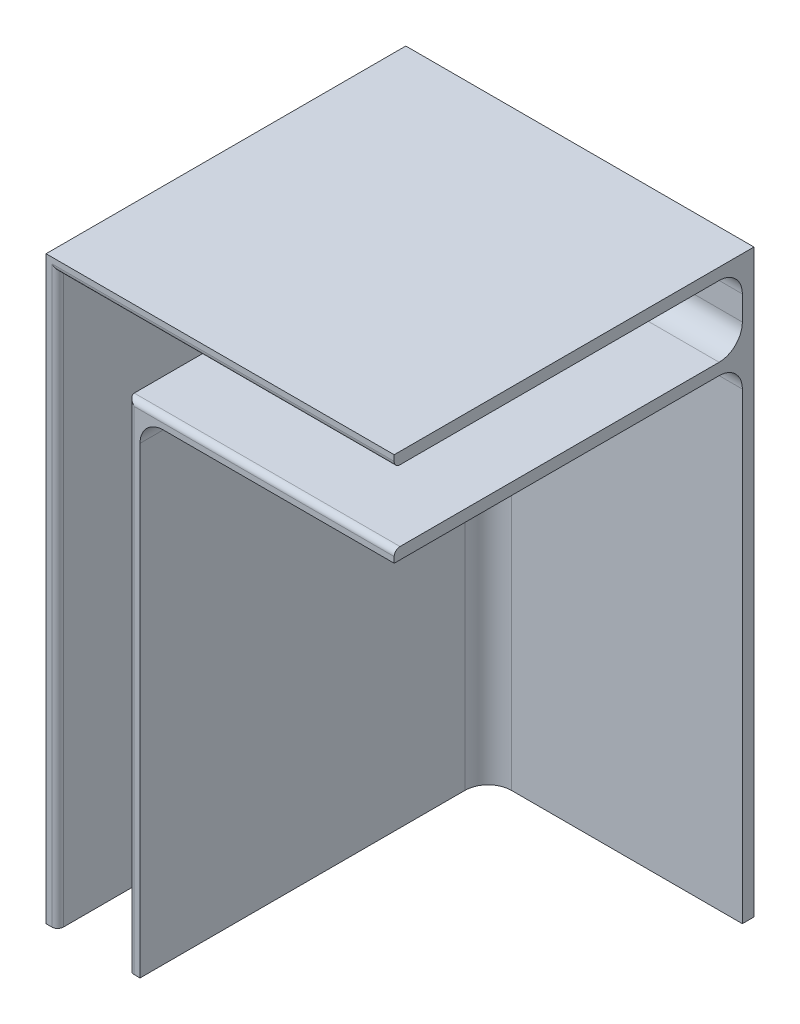
ISO-10303-21;
HEADER;
FILE_DESCRIPTION(('STEP AP214'),'2;1');
FILE_NAME('part.step','',(''),(''),'','','');
FILE_SCHEMA(('AUTOMOTIVE_DESIGN { 1 0 10303 214 1 1 1 1 }'));
ENDSEC;
DATA;
#1=APPLICATION_CONTEXT('core data for automotive mechanical design processes');
#2=APPLICATION_PROTOCOL_DEFINITION('international standard','automotive_design',2000,#1);
#3=PRODUCT_CONTEXT('',#1,'mechanical');
#4=PRODUCT('Part','Part','',(#3));
#5=PRODUCT_RELATED_PRODUCT_CATEGORY('part','',(#4));
#6=PRODUCT_DEFINITION_FORMATION('','',#4);
#7=PRODUCT_DEFINITION_CONTEXT('part definition',#1,'design');
#8=PRODUCT_DEFINITION('design','',#6,#7);
#9=PRODUCT_DEFINITION_SHAPE('','',#8);
#10=(LENGTH_UNIT() NAMED_UNIT(*) SI_UNIT(.MILLI.,.METRE.));
#11=(NAMED_UNIT(*) PLANE_ANGLE_UNIT() SI_UNIT($,.RADIAN.));
#12=(NAMED_UNIT(*) SI_UNIT($,.STERADIAN.) SOLID_ANGLE_UNIT());
#13=UNCERTAINTY_MEASURE_WITH_UNIT(LENGTH_MEASURE(1.E-05),#10,'distance_accuracy_value','');
#14=(GEOMETRIC_REPRESENTATION_CONTEXT(3) GLOBAL_UNCERTAINTY_ASSIGNED_CONTEXT((#13)) GLOBAL_UNIT_ASSIGNED_CONTEXT((#10,
#11,#12)) REPRESENTATION_CONTEXT('',''));
#15=CARTESIAN_POINT('',(0.,0.,0.));
#16=DIRECTION('',(0.,0.,1.));
#17=DIRECTION('',(1.,0.,0.));
#18=AXIS2_PLACEMENT_3D('',#15,#16,#17);
#19=CARTESIAN_POINT('',(0.,0.,1.));
#20=DIRECTION('',(0.,0.,-1.));
#21=DIRECTION('',(-1.,0.,0.));
#22=AXIS2_PLACEMENT_3D('',#19,#20,#21);
#23=PLANE('',#22);
#24=DIRECTION('',(0.,-1.,0.));
#25=VECTOR('',#24,1.);
#26=CARTESIAN_POINT('',(5.1,42.9,1.));
#27=LINE('',#26,#25);
#28=CARTESIAN_POINT('',(5.1,0.,1.));
#29=VERTEX_POINT('',#28);
#30=CARTESIAN_POINT('',(5.1,44.9,1.));
#31=VERTEX_POINT('',#30);
#32=EDGE_CURVE('E270',#29,#31,#27,.F.);
#33=ORIENTED_EDGE('',*,*,#32,.T.);
#34=DIRECTION('',(-1.,0.,0.));
#35=VECTOR('',#34,1.);
#36=CARTESIAN_POINT('',(30.,44.9,1.));
#37=LINE('',#36,#35);
#38=CARTESIAN_POINT('',(30.,44.9,1.));
#39=VERTEX_POINT('',#38);
#40=EDGE_CURVE('E272',#31,#39,#37,.F.);
#41=ORIENTED_EDGE('',*,*,#40,.T.);
#42=DIRECTION('',(0.,1.,0.));
#43=VECTOR('',#42,1.);
#44=CARTESIAN_POINT('',(30.,0.,1.));
#45=LINE('',#44,#43);
#46=CARTESIAN_POINT('',(30.,47.,1.));
#47=VERTEX_POINT('',#46);
#48=EDGE_CURVE('E244',#39,#47,#45,.T.);
#49=ORIENTED_EDGE('',*,*,#48,.T.);
#50=DIRECTION('',(1.,0.,0.));
#51=VECTOR('',#50,1.);
#52=CARTESIAN_POINT('',(1.,47.,1.));
#53=LINE('',#52,#51);
#54=CARTESIAN_POINT('',(3.,47.,1.));
#55=VERTEX_POINT('',#54);
#56=EDGE_CURVE('E268',#47,#55,#53,.F.);
#57=ORIENTED_EDGE('',*,*,#56,.T.);
#58=DIRECTION('',(0.,1.,0.));
#59=VECTOR('',#58,1.);
#60=CARTESIAN_POINT('',(3.00000000000001,0.,1.));
#61=LINE('',#60,#59);
#62=CARTESIAN_POINT('',(3.00000000000001,0.,1.));
#63=VERTEX_POINT('',#62);
#64=EDGE_CURVE('E266',#55,#63,#61,.F.);
#65=ORIENTED_EDGE('',*,*,#64,.T.);
#66=DIRECTION('',(1.,0.,0.));
#67=VECTOR('',#66,1.);
#68=CARTESIAN_POINT('',(0.,0.,1.));
#69=LINE('',#68,#67);
#70=EDGE_CURVE('E238',#63,#29,#69,.T.);
#71=ORIENTED_EDGE('',*,*,#70,.T.);
#72=EDGE_LOOP('',(#33,#41,#49,#57,#65,#71));
#73=FACE_BOUND('',#72,.T.);
#74=ADVANCED_FACE('F33',(#73),#23,.F.);
#75=DIRECTION('',(1.,0.,0.));
#76=VECTOR('',#75,1.);
#77=CARTESIAN_POINT('',(8.1,39.9,1.));
#78=LINE('',#77,#76);
#79=CARTESIAN_POINT('',(30.,39.9,1.));
#80=VERTEX_POINT('',#79);
#81=CARTESIAN_POINT('',(10.1,39.9,1.));
#82=VERTEX_POINT('',#81);
#83=EDGE_CURVE('E291',#80,#82,#78,.F.);
#84=ORIENTED_EDGE('',*,*,#83,.T.);
#85=DIRECTION('',(0.,1.,0.));
#86=VECTOR('',#85,1.);
#87=CARTESIAN_POINT('',(10.1,0.,1.));
#88=LINE('',#87,#86);
#89=CARTESIAN_POINT('',(10.1,0.,1.));
#90=VERTEX_POINT('',#89);
#91=EDGE_CURVE('E293',#82,#90,#88,.F.);
#92=ORIENTED_EDGE('',*,*,#91,.T.);
#93=CARTESIAN_POINT('',(30.,0.,1.));
#94=VERTEX_POINT('',#93);
#95=EDGE_CURVE('E236',#90,#94,#69,.T.);
#96=ORIENTED_EDGE('',*,*,#95,.T.);
#97=EDGE_CURVE('E240',#94,#80,#45,.T.);
#98=ORIENTED_EDGE('',*,*,#97,.T.);
#99=EDGE_LOOP('',(#84,#92,#96,#98));
#100=FACE_BOUND('',#99,.T.);
#101=ADVANCED_FACE('F432',(#100),#23,.F.);
#102=CARTESIAN_POINT('',(0.,0.,1.));
#103=DIRECTION('',(1.,0.,0.));
#104=DIRECTION('',(0.,0.,-1.));
#105=AXIS2_PLACEMENT_3D('',#102,#103,#104);
#106=PLANE('',#105);
#107=DIRECTION('',(0.,-1.,0.));
#108=VECTOR('',#107,1.);
#109=CARTESIAN_POINT('',(0.,0.,0.));
#110=LINE('',#109,#108);
#111=CARTESIAN_POINT('',(0.,50.,0.));
#112=VERTEX_POINT('',#111);
#113=CARTESIAN_POINT('',(0.,0.,0.));
#114=VERTEX_POINT('',#113);
#115=EDGE_CURVE('E235',#112,#114,#110,.T.);
#116=ORIENTED_EDGE('',*,*,#115,.T.);
#117=DIRECTION('',(0.,0.,-1.));
#118=VECTOR('',#117,1.);
#119=CARTESIAN_POINT('',(0.,0.,1.));
#120=LINE('',#119,#118);
#121=CARTESIAN_POINT('',(0.,0.,31.));
#122=VERTEX_POINT('',#121);
#123=EDGE_CURVE('E260',#122,#114,#120,.T.);
#124=ORIENTED_EDGE('',*,*,#123,.F.);
#125=DIRECTION('',(0.,-1.,0.));
#126=VECTOR('',#125,1.);
#127=CARTESIAN_POINT('',(0.,50.,31.));
#128=LINE('',#127,#126);
#129=CARTESIAN_POINT('',(0.,50.,31.));
#130=VERTEX_POINT('',#129);
#131=EDGE_CURVE('E218',#130,#122,#128,.T.);
#132=ORIENTED_EDGE('',*,*,#131,.F.);
#133=DIRECTION('',(0.,0.,-1.));
#134=VECTOR('',#133,1.);
#135=CARTESIAN_POINT('',(0.,50.,1.));
#136=LINE('',#135,#134);
#137=EDGE_CURVE('E243',#130,#112,#136,.T.);
#138=ORIENTED_EDGE('',*,*,#137,.T.);
#139=EDGE_LOOP('',(#116,#124,#132,#138));
#140=FACE_BOUND('',#139,.T.);
#141=ADVANCED_FACE('F408',(#140),#106,.F.);
#142=CARTESIAN_POINT('',(0.,0.,1.));
#143=DIRECTION('',(0.,1.,0.));
#144=DIRECTION('',(0.,0.,1.));
#145=AXIS2_PLACEMENT_3D('',#142,#143,#144);
#146=PLANE('',#145);
#147=DIRECTION('',(1.,0.,0.));
#148=VECTOR('',#147,1.);
#149=CARTESIAN_POINT('',(7.1,0.,31.));
#150=LINE('',#149,#148);
#151=CARTESIAN_POINT('',(7.6,0.,31.));
#152=VERTEX_POINT('',#151);
#153=CARTESIAN_POINT('',(8.10000000000001,0.,31.));
#154=VERTEX_POINT('',#153);
#155=EDGE_CURVE('E180',#152,#154,#150,.T.);
#156=ORIENTED_EDGE('',*,*,#155,.F.);
#157=CARTESIAN_POINT('',(7.6,0.,30.5));
#158=DIRECTION('',(0.,1.,0.));
#159=DIRECTION('',(0.,0.,1.));
#160=AXIS2_PLACEMENT_3D('',#157,#158,#159);
#161=CIRCLE('',#160,0.5);
#162=CARTESIAN_POINT('',(7.1,0.,30.5));
#163=VERTEX_POINT('',#162);
#164=EDGE_CURVE('E56',#152,#163,#161,.F.);
#165=ORIENTED_EDGE('',*,*,#164,.T.);
#166=DIRECTION('',(0.,0.,-1.));
#167=VECTOR('',#166,1.);
#168=CARTESIAN_POINT('',(7.1,0.,31.));
#169=LINE('',#168,#167);
#170=CARTESIAN_POINT('',(7.1,0.,3.));
#171=VERTEX_POINT('',#170);
#172=EDGE_CURVE('E200',#163,#171,#169,.T.);
#173=ORIENTED_EDGE('',*,*,#172,.T.);
#174=CARTESIAN_POINT('',(5.1,0.,3.));
#175=DIRECTION('',(0.,1.,0.));
#176=DIRECTION('',(0.,0.,1.));
#177=AXIS2_PLACEMENT_3D('',#174,#175,#176);
#178=CIRCLE('',#177,2.);
#179=EDGE_CURVE('E298',#171,#29,#178,.T.);
#180=ORIENTED_EDGE('',*,*,#179,.T.);
#181=ORIENTED_EDGE('',*,*,#70,.F.);
#182=CARTESIAN_POINT('',(3.00000000000001,0.,3.));
#183=DIRECTION('',(0.,1.,0.));
#184=DIRECTION('',(0.,0.,1.));
#185=AXIS2_PLACEMENT_3D('',#182,#183,#184);
#186=CIRCLE('',#185,2.);
#187=CARTESIAN_POINT('',(1.00000000000001,0.,3.));
#188=VERTEX_POINT('',#187);
#189=EDGE_CURVE('E302',#63,#188,#186,.T.);
#190=ORIENTED_EDGE('',*,*,#189,.T.);
#191=DIRECTION('',(0.,0.,-1.));
#192=VECTOR('',#191,1.);
#193=CARTESIAN_POINT('',(1.00000000000001,0.,31.));
#194=LINE('',#193,#192);
#195=CARTESIAN_POINT('',(1.00000000000001,0.,30.5));
#196=VERTEX_POINT('',#195);
#197=EDGE_CURVE('E233',#196,#188,#194,.T.);
#198=ORIENTED_EDGE('',*,*,#197,.F.);
#199=CARTESIAN_POINT('',(0.500000000000007,0.,30.5));
#200=DIRECTION('',(0.,1.,0.));
#201=DIRECTION('',(0.,0.,1.));
#202=AXIS2_PLACEMENT_3D('',#199,#200,#201);
#203=CIRCLE('',#202,0.5);
#204=CARTESIAN_POINT('',(0.500000000000007,0.,31.));
#205=VERTEX_POINT('',#204);
#206=EDGE_CURVE('E341',#196,#205,#203,.F.);
#207=ORIENTED_EDGE('',*,*,#206,.T.);
#208=DIRECTION('',(1.,0.,0.));
#209=VECTOR('',#208,1.);
#210=CARTESIAN_POINT('',(0.,0.,31.));
#211=LINE('',#210,#209);
#212=EDGE_CURVE('E221',#122,#205,#211,.T.);
#213=ORIENTED_EDGE('',*,*,#212,.F.);
#214=ORIENTED_EDGE('',*,*,#123,.T.);
#215=DIRECTION('',(1.,0.,0.));
#216=VECTOR('',#215,1.);
#217=CARTESIAN_POINT('',(0.,0.,0.));
#218=LINE('',#217,#216);
#219=CARTESIAN_POINT('',(30.,0.,0.));
#220=VERTEX_POINT('',#219);
#221=EDGE_CURVE('E247',#114,#220,#218,.T.);
#222=ORIENTED_EDGE('',*,*,#221,.T.);
#223=DIRECTION('',(0.,0.,-1.));
#224=VECTOR('',#223,1.);
#225=CARTESIAN_POINT('',(30.,0.,1.));
#226=LINE('',#225,#224);
#227=EDGE_CURVE('E257',#94,#220,#226,.T.);
#228=ORIENTED_EDGE('',*,*,#227,.F.);
#229=ORIENTED_EDGE('',*,*,#95,.F.);
#230=CARTESIAN_POINT('',(10.1,0.,3.));
#231=DIRECTION('',(0.,1.,0.));
#232=DIRECTION('',(0.,0.,1.));
#233=AXIS2_PLACEMENT_3D('',#230,#231,#232);
#234=CIRCLE('',#233,2.);
#235=CARTESIAN_POINT('',(8.10000000000001,0.,3.));
#236=VERTEX_POINT('',#235);
#237=EDGE_CURVE('E197',#90,#236,#234,.T.);
#238=ORIENTED_EDGE('',*,*,#237,.T.);
#239=DIRECTION('',(0.,0.,-1.));
#240=VECTOR('',#239,1.);
#241=CARTESIAN_POINT('',(8.10000000000001,0.,31.));
#242=LINE('',#241,#240);
#243=EDGE_CURVE('E193',#154,#236,#242,.T.);
#244=ORIENTED_EDGE('',*,*,#243,.F.);
#245=EDGE_LOOP('',(#156,#165,#173,#180,#181,#190,#198,#207,#213,#214,#222,#228,#229,#238,#244));
#246=FACE_BOUND('',#245,.T.);
#247=ADVANCED_FACE('F194',(#246),#146,.F.);
#248=CARTESIAN_POINT('',(30.,0.,1.));
#249=DIRECTION('',(-1.,0.,0.));
#250=DIRECTION('',(0.,0.,1.));
#251=AXIS2_PLACEMENT_3D('',#248,#249,#250);
#252=PLANE('',#251);
#253=DIRECTION('',(0.,1.,0.));
#254=VECTOR('',#253,1.);
#255=CARTESIAN_POINT('',(30.,50.,31.));
#256=LINE('',#255,#254);
#257=CARTESIAN_POINT('',(30.,49.5,31.));
#258=VERTEX_POINT('',#257);
#259=CARTESIAN_POINT('',(30.,50.,31.));
#260=VERTEX_POINT('',#259);
#261=EDGE_CURVE('E224',#258,#260,#256,.T.);
#262=ORIENTED_EDGE('',*,*,#261,.F.);
#263=CARTESIAN_POINT('',(30.,49.5,30.5));
#264=DIRECTION('',(-1.,0.,0.));
#265=DIRECTION('',(0.,0.,1.));
#266=AXIS2_PLACEMENT_3D('',#263,#264,#265);
#267=CIRCLE('',#266,0.5);
#268=CARTESIAN_POINT('',(30.,49.,30.5));
#269=VERTEX_POINT('',#268);
#270=EDGE_CURVE('E332',#258,#269,#267,.F.);
#271=ORIENTED_EDGE('',*,*,#270,.T.);
#272=DIRECTION('',(0.,0.,-1.));
#273=VECTOR('',#272,1.);
#274=CARTESIAN_POINT('',(30.,49.,31.));
#275=LINE('',#274,#273);
#276=CARTESIAN_POINT('',(30.,49.,3.));
#277=VERTEX_POINT('',#276);
#278=EDGE_CURVE('E229',#269,#277,#275,.T.);
#279=ORIENTED_EDGE('',*,*,#278,.T.);
#280=CARTESIAN_POINT('',(30.,47.,3.));
#281=DIRECTION('',(-1.,0.,0.));
#282=DIRECTION('',(0.,0.,1.));
#283=AXIS2_PLACEMENT_3D('',#280,#281,#282);
#284=CIRCLE('',#283,2.);
#285=EDGE_CURVE('E300',#277,#47,#284,.T.);
#286=ORIENTED_EDGE('',*,*,#285,.T.);
#287=ORIENTED_EDGE('',*,*,#48,.F.);
#288=CARTESIAN_POINT('',(30.,44.9,3.));
#289=DIRECTION('',(-1.,0.,0.));
#290=DIRECTION('',(0.,0.,1.));
#291=AXIS2_PLACEMENT_3D('',#288,#289,#290);
#292=CIRCLE('',#291,2.);
#293=CARTESIAN_POINT('',(30.,42.9,3.));
#294=VERTEX_POINT('',#293);
#295=EDGE_CURVE('E295',#39,#294,#292,.T.);
#296=ORIENTED_EDGE('',*,*,#295,.T.);
#297=DIRECTION('',(0.,0.,-1.));
#298=VECTOR('',#297,1.);
#299=CARTESIAN_POINT('',(30.,42.9,31.));
#300=LINE('',#299,#298);
#301=CARTESIAN_POINT('',(30.,42.9,30.5));
#302=VERTEX_POINT('',#301);
#303=EDGE_CURVE('E216',#302,#294,#300,.T.);
#304=ORIENTED_EDGE('',*,*,#303,.F.);
#305=CARTESIAN_POINT('',(30.,42.4,30.5));
#306=DIRECTION('',(-1.,0.,0.));
#307=DIRECTION('',(0.,0.,1.));
#308=AXIS2_PLACEMENT_3D('',#305,#306,#307);
#309=CIRCLE('',#308,0.5);
#310=CARTESIAN_POINT('',(30.,42.4,31.));
#311=VERTEX_POINT('',#310);
#312=EDGE_CURVE('E330',#302,#311,#309,.F.);
#313=ORIENTED_EDGE('',*,*,#312,.T.);
#314=DIRECTION('',(0.,1.,0.));
#315=VECTOR('',#314,1.);
#316=CARTESIAN_POINT('',(30.,41.9,31.));
#317=LINE('',#316,#315);
#318=CARTESIAN_POINT('',(30.,41.9,31.));
#319=VERTEX_POINT('',#318);
#320=EDGE_CURVE('E190',#319,#311,#317,.T.);
#321=ORIENTED_EDGE('',*,*,#320,.F.);
#322=DIRECTION('',(0.,0.,-1.));
#323=VECTOR('',#322,1.);
#324=CARTESIAN_POINT('',(30.,41.9,31.));
#325=LINE('',#324,#323);
#326=CARTESIAN_POINT('',(30.,41.9,3.));
#327=VERTEX_POINT('',#326);
#328=EDGE_CURVE('E201',#319,#327,#325,.T.);
#329=ORIENTED_EDGE('',*,*,#328,.T.);
#330=CARTESIAN_POINT('',(30.,39.9,3.));
#331=DIRECTION('',(-1.,0.,0.));
#332=DIRECTION('',(0.,0.,1.));
#333=AXIS2_PLACEMENT_3D('',#330,#331,#332);
#334=CIRCLE('',#333,2.);
#335=EDGE_CURVE('E308',#327,#80,#334,.T.);
#336=ORIENTED_EDGE('',*,*,#335,.T.);
#337=ORIENTED_EDGE('',*,*,#97,.F.);
#338=ORIENTED_EDGE('',*,*,#227,.T.);
#339=DIRECTION('',(0.,1.,0.));
#340=VECTOR('',#339,1.);
#341=CARTESIAN_POINT('',(30.,0.,0.));
#342=LINE('',#341,#340);
#343=CARTESIAN_POINT('',(30.,50.,0.));
#344=VERTEX_POINT('',#343);
#345=EDGE_CURVE('E249',#220,#344,#342,.T.);
#346=ORIENTED_EDGE('',*,*,#345,.T.);
#347=DIRECTION('',(0.,0.,-1.));
#348=VECTOR('',#347,1.);
#349=CARTESIAN_POINT('',(30.,50.,1.));
#350=LINE('',#349,#348);
#351=EDGE_CURVE('E254',#260,#344,#350,.T.);
#352=ORIENTED_EDGE('',*,*,#351,.F.);
#353=EDGE_LOOP('',(#262,#271,#279,#286,#287,#296,#304,#313,#321,#329,#336,#337,#338,#346,#352));
#354=FACE_BOUND('',#353,.T.);
#355=ADVANCED_FACE('F362',(#354),#252,.F.);
#356=CARTESIAN_POINT('',(0.,50.,1.));
#357=DIRECTION('',(0.,-1.,0.));
#358=DIRECTION('',(0.,0.,-1.));
#359=AXIS2_PLACEMENT_3D('',#356,#357,#358);
#360=PLANE('',#359);
#361=DIRECTION('',(-1.,0.,0.));
#362=VECTOR('',#361,1.);
#363=CARTESIAN_POINT('',(0.,50.,0.));
#364=LINE('',#363,#362);
#365=EDGE_CURVE('E239',#344,#112,#364,.T.);
#366=ORIENTED_EDGE('',*,*,#365,.T.);
#367=ORIENTED_EDGE('',*,*,#137,.F.);
#368=DIRECTION('',(-1.,0.,0.));
#369=VECTOR('',#368,1.);
#370=CARTESIAN_POINT('',(0.,50.,31.));
#371=LINE('',#370,#369);
#372=EDGE_CURVE('E226',#260,#130,#371,.T.);
#373=ORIENTED_EDGE('',*,*,#372,.F.);
#374=ORIENTED_EDGE('',*,*,#351,.T.);
#375=EDGE_LOOP('',(#366,#367,#373,#374));
#376=FACE_BOUND('',#375,.T.);
#377=ADVANCED_FACE('F417',(#376),#360,.F.);
#378=CARTESIAN_POINT('',(0.,0.,0.));
#379=DIRECTION('',(0.,0.,-1.));
#380=DIRECTION('',(-1.,0.,0.));
#381=AXIS2_PLACEMENT_3D('',#378,#379,#380);
#382=PLANE('',#381);
#383=ORIENTED_EDGE('',*,*,#115,.F.);
#384=ORIENTED_EDGE('',*,*,#365,.F.);
#385=ORIENTED_EDGE('',*,*,#345,.F.);
#386=ORIENTED_EDGE('',*,*,#221,.F.);
#387=EDGE_LOOP('',(#383,#384,#385,#386));
#388=FACE_BOUND('',#387,.T.);
#389=ADVANCED_FACE('F411',(#388),#382,.T.);
#390=CARTESIAN_POINT('',(1.,49.,31.));
#391=DIRECTION('',(-1.,0.,0.));
#392=DIRECTION('',(0.,-1.,0.));
#393=AXIS2_PLACEMENT_3D('',#390,#391,#392);
#394=PLANE('',#393);
#395=DIRECTION('',(0.,0.,-1.));
#396=VECTOR('',#395,1.);
#397=CARTESIAN_POINT('',(1.,49.,31.));
#398=LINE('',#397,#396);
#399=CARTESIAN_POINT('',(1.,49.,30.5));
#400=VERTEX_POINT('',#399);
#401=CARTESIAN_POINT('',(1.,49.,3.));
#402=VERTEX_POINT('',#401);
#403=EDGE_CURVE('E231',#400,#402,#398,.T.);
#404=ORIENTED_EDGE('',*,*,#403,.F.);
#405=DIRECTION('',(0.,1.,0.));
#406=VECTOR('',#405,1.);
#407=CARTESIAN_POINT('',(1.00000000000001,0.,30.5));
#408=LINE('',#407,#406);
#409=EDGE_CURVE('E11',#400,#196,#408,.F.);
#410=ORIENTED_EDGE('',*,*,#409,.T.);
#411=ORIENTED_EDGE('',*,*,#197,.T.);
#412=DIRECTION('',(0.,1.,0.));
#413=VECTOR('',#412,1.);
#414=CARTESIAN_POINT('',(1.,49.,3.));
#415=LINE('',#414,#413);
#416=EDGE_CURVE('E280',#188,#402,#415,.T.);
#417=ORIENTED_EDGE('',*,*,#416,.T.);
#418=EDGE_LOOP('',(#404,#410,#411,#417));
#419=FACE_BOUND('',#418,.T.);
#420=ADVANCED_FACE('F441',(#419),#394,.F.);
#421=CARTESIAN_POINT('',(1.,49.,31.));
#422=DIRECTION('',(0.,1.,0.));
#423=DIRECTION('',(0.,0.,1.));
#424=AXIS2_PLACEMENT_3D('',#421,#422,#423);
#425=PLANE('',#424);
#426=ORIENTED_EDGE('',*,*,#278,.F.);
#427=DIRECTION('',(1.,0.,0.));
#428=VECTOR('',#427,1.);
#429=CARTESIAN_POINT('',(1.,49.,30.5));
#430=LINE('',#429,#428);
#431=EDGE_CURVE('E334',#269,#400,#430,.F.);
#432=ORIENTED_EDGE('',*,*,#431,.T.);
#433=ORIENTED_EDGE('',*,*,#403,.T.);
#434=DIRECTION('',(1.,0.,0.));
#435=VECTOR('',#434,1.);
#436=CARTESIAN_POINT('',(30.,49.,3.));
#437=LINE('',#436,#435);
#438=EDGE_CURVE('E277',#402,#277,#437,.T.);
#439=ORIENTED_EDGE('',*,*,#438,.T.);
#440=EDGE_LOOP('',(#426,#432,#433,#439));
#441=FACE_BOUND('',#440,.T.);
#442=ADVANCED_FACE('F420',(#441),#425,.F.);
#443=CARTESIAN_POINT('',(0.,0.,31.));
#444=DIRECTION('',(0.,0.,1.));
#445=DIRECTION('',(1.,0.,0.));
#446=AXIS2_PLACEMENT_3D('',#443,#444,#445);
#447=PLANE('',#446);
#448=DIRECTION('',(0.,1.,0.));
#449=VECTOR('',#448,1.);
#450=CARTESIAN_POINT('',(0.500000000000001,49.,31.));
#451=LINE('',#450,#449);
#452=CARTESIAN_POINT('',(0.500000000000001,49.5,31.));
#453=VERTEX_POINT('',#452);
#454=EDGE_CURVE('E310',#205,#453,#451,.T.);
#455=ORIENTED_EDGE('',*,*,#454,.T.);
#456=DIRECTION('',(1.,0.,0.));
#457=VECTOR('',#456,1.);
#458=CARTESIAN_POINT('',(30.,49.5,31.));
#459=LINE('',#458,#457);
#460=EDGE_CURVE('E327',#453,#258,#459,.T.);
#461=ORIENTED_EDGE('',*,*,#460,.T.);
#462=ORIENTED_EDGE('',*,*,#261,.T.);
#463=ORIENTED_EDGE('',*,*,#372,.T.);
#464=ORIENTED_EDGE('',*,*,#131,.T.);
#465=ORIENTED_EDGE('',*,*,#212,.T.);
#466=EDGE_LOOP('',(#455,#461,#462,#463,#464,#465));
#467=FACE_BOUND('',#466,.T.);
#468=ADVANCED_FACE('F403',(#467),#447,.T.);
#469=CARTESIAN_POINT('',(30.,42.9,31.));
#470=DIRECTION('',(0.,-1.,0.));
#471=DIRECTION('',(0.,0.,-1.));
#472=AXIS2_PLACEMENT_3D('',#469,#470,#471);
#473=PLANE('',#472);
#474=DIRECTION('',(0.,0.,-1.));
#475=VECTOR('',#474,1.);
#476=CARTESIAN_POINT('',(7.1,42.9,31.));
#477=LINE('',#476,#475);
#478=CARTESIAN_POINT('',(7.1,42.9,30.5));
#479=VERTEX_POINT('',#478);
#480=CARTESIAN_POINT('',(7.1,42.9,3.));
#481=VERTEX_POINT('',#480);
#482=EDGE_CURVE('E214',#479,#481,#477,.T.);
#483=ORIENTED_EDGE('',*,*,#482,.F.);
#484=DIRECTION('',(-1.,0.,0.));
#485=VECTOR('',#484,1.);
#486=CARTESIAN_POINT('',(30.,42.9,30.5));
#487=LINE('',#486,#485);
#488=EDGE_CURVE('E339',#479,#302,#487,.F.);
#489=ORIENTED_EDGE('',*,*,#488,.T.);
#490=ORIENTED_EDGE('',*,*,#303,.T.);
#491=DIRECTION('',(-1.,0.,0.));
#492=VECTOR('',#491,1.);
#493=CARTESIAN_POINT('',(7.1,42.9,3.));
#494=LINE('',#493,#492);
#495=EDGE_CURVE('E263',#294,#481,#494,.T.);
#496=ORIENTED_EDGE('',*,*,#495,.T.);
#497=EDGE_LOOP('',(#483,#489,#490,#496));
#498=FACE_BOUND('',#497,.T.);
#499=ADVANCED_FACE('F370',(#498),#473,.F.);
#500=CARTESIAN_POINT('',(7.1,41.9,31.));
#501=DIRECTION('',(1.,0.,0.));
#502=DIRECTION('',(0.,0.,-1.));
#503=AXIS2_PLACEMENT_3D('',#500,#501,#502);
#504=PLANE('',#503);
#505=ORIENTED_EDGE('',*,*,#172,.F.);
#506=DIRECTION('',(0.,-1.,0.));
#507=VECTOR('',#506,1.);
#508=CARTESIAN_POINT('',(7.1,42.9,30.5));
#509=LINE('',#508,#507);
#510=EDGE_CURVE('E42',#163,#479,#509,.F.);
#511=ORIENTED_EDGE('',*,*,#510,.T.);
#512=ORIENTED_EDGE('',*,*,#482,.T.);
#513=DIRECTION('',(0.,-1.,0.));
#514=VECTOR('',#513,1.);
#515=CARTESIAN_POINT('',(7.1,0.,3.));
#516=LINE('',#515,#514);
#517=EDGE_CURVE('E274',#481,#171,#516,.T.);
#518=ORIENTED_EDGE('',*,*,#517,.T.);
#519=EDGE_LOOP('',(#505,#511,#512,#518));
#520=FACE_BOUND('',#519,.T.);
#521=ADVANCED_FACE('F372',(#520),#504,.F.);
#522=CARTESIAN_POINT('',(8.1,41.9,31.));
#523=DIRECTION('',(-1.,0.,0.));
#524=DIRECTION('',(0.,-1.,0.));
#525=AXIS2_PLACEMENT_3D('',#522,#523,#524);
#526=PLANE('',#525);
#527=DIRECTION('',(0.,1.,0.));
#528=VECTOR('',#527,1.);
#529=CARTESIAN_POINT('',(8.1,41.9,3.));
#530=LINE('',#529,#528);
#531=CARTESIAN_POINT('',(8.1,39.9,3.));
#532=VERTEX_POINT('',#531);
#533=EDGE_CURVE('E288',#236,#532,#530,.T.);
#534=ORIENTED_EDGE('',*,*,#533,.T.);
#535=DIRECTION('',(0.,0.,-1.));
#536=VECTOR('',#535,1.);
#537=CARTESIAN_POINT('',(8.1,39.9,31.));
#538=LINE('',#537,#536);
#539=CARTESIAN_POINT('',(8.1,39.9,31.));
#540=VERTEX_POINT('',#539);
#541=EDGE_CURVE('E205',#532,#540,#538,.F.);
#542=ORIENTED_EDGE('',*,*,#541,.T.);
#543=DIRECTION('',(0.,1.,0.));
#544=VECTOR('',#543,1.);
#545=CARTESIAN_POINT('',(8.1,41.9,31.));
#546=LINE('',#545,#544);
#547=EDGE_CURVE('E185',#154,#540,#546,.T.);
#548=ORIENTED_EDGE('',*,*,#547,.F.);
#549=ORIENTED_EDGE('',*,*,#243,.T.);
#550=EDGE_LOOP('',(#534,#542,#548,#549));
#551=FACE_BOUND('',#550,.T.);
#552=ADVANCED_FACE('F203',(#551),#526,.F.);
#553=CARTESIAN_POINT('',(30.,41.9,31.));
#554=DIRECTION('',(0.,1.,0.));
#555=DIRECTION('',(0.,0.,1.));
#556=AXIS2_PLACEMENT_3D('',#553,#554,#555);
#557=PLANE('',#556);
#558=DIRECTION('',(1.,0.,0.));
#559=VECTOR('',#558,1.);
#560=CARTESIAN_POINT('',(30.,41.9,31.));
#561=LINE('',#560,#559);
#562=CARTESIAN_POINT('',(10.1,41.9,31.));
#563=VERTEX_POINT('',#562);
#564=EDGE_CURVE('E206',#563,#319,#561,.T.);
#565=ORIENTED_EDGE('',*,*,#564,.F.);
#566=DIRECTION('',(0.,0.,-1.));
#567=VECTOR('',#566,1.);
#568=CARTESIAN_POINT('',(10.1,41.9,1.));
#569=LINE('',#568,#567);
#570=CARTESIAN_POINT('',(10.1,41.9,3.));
#571=VERTEX_POINT('',#570);
#572=EDGE_CURVE('E285',#563,#571,#569,.T.);
#573=ORIENTED_EDGE('',*,*,#572,.T.);
#574=DIRECTION('',(1.,0.,0.));
#575=VECTOR('',#574,1.);
#576=CARTESIAN_POINT('',(30.,41.9,3.));
#577=LINE('',#576,#575);
#578=EDGE_CURVE('E283',#571,#327,#577,.T.);
#579=ORIENTED_EDGE('',*,*,#578,.T.);
#580=ORIENTED_EDGE('',*,*,#328,.F.);
#581=EDGE_LOOP('',(#565,#573,#579,#580));
#582=FACE_BOUND('',#581,.T.);
#583=ADVANCED_FACE('F484',(#582),#557,.F.);
#584=CARTESIAN_POINT('',(0.,0.,31.));
#585=DIRECTION('',(0.,0.,1.));
#586=DIRECTION('',(1.,0.,0.));
#587=AXIS2_PLACEMENT_3D('',#584,#585,#586);
#588=PLANE('',#587);
#589=ORIENTED_EDGE('',*,*,#320,.T.);
#590=DIRECTION('',(-1.,0.,0.));
#591=VECTOR('',#590,1.);
#592=CARTESIAN_POINT('',(7.1,42.4,31.));
#593=LINE('',#592,#591);
#594=CARTESIAN_POINT('',(7.6,42.4,31.));
#595=VERTEX_POINT('',#594);
#596=EDGE_CURVE('E337',#311,#595,#593,.T.);
#597=ORIENTED_EDGE('',*,*,#596,.T.);
#598=DIRECTION('',(0.,-1.,0.));
#599=VECTOR('',#598,1.);
#600=CARTESIAN_POINT('',(7.6,0.,31.));
#601=LINE('',#600,#599);
#602=EDGE_CURVE('E189',#595,#152,#601,.T.);
#603=ORIENTED_EDGE('',*,*,#602,.T.);
#604=ORIENTED_EDGE('',*,*,#155,.T.);
#605=ORIENTED_EDGE('',*,*,#547,.T.);
#606=CARTESIAN_POINT('',(10.1,39.9,31.));
#607=DIRECTION('',(0.,0.,1.));
#608=DIRECTION('',(1.,0.,0.));
#609=AXIS2_PLACEMENT_3D('',#606,#607,#608);
#610=CIRCLE('',#609,2.);
#611=EDGE_CURVE('E305',#540,#563,#610,.F.);
#612=ORIENTED_EDGE('',*,*,#611,.T.);
#613=ORIENTED_EDGE('',*,*,#564,.T.);
#614=EDGE_LOOP('',(#589,#597,#603,#604,#605,#612,#613));
#615=FACE_BOUND('',#614,.T.);
#616=ADVANCED_FACE('F183',(#615),#588,.T.);
#617=CARTESIAN_POINT('',(5.1,41.9,3.));
#618=DIRECTION('',(0.,1.,0.));
#619=DIRECTION('',(0.,0.,1.));
#620=AXIS2_PLACEMENT_3D('',#617,#618,#619);
#621=CYLINDRICAL_SURFACE('',#620,2.);
#622=ORIENTED_EDGE('',*,*,#179,.F.);
#623=ORIENTED_EDGE('',*,*,#517,.F.);
#624=CARTESIAN_POINT('',(5.1,44.9,3.));
#625=DIRECTION('',(0.707106781186547,0.707106781186547,0.));
#626=DIRECTION('',(-0.707106781186547,0.707106781186547,0.));
#627=AXIS2_PLACEMENT_3D('',#624,#625,#626);
#628=ELLIPSE('',#627,2.82842712474619,2.);
#629=EDGE_CURVE('E311',#31,#481,#628,.F.);
#630=ORIENTED_EDGE('',*,*,#629,.F.);
#631=ORIENTED_EDGE('',*,*,#32,.F.);
#632=EDGE_LOOP('',(#622,#623,#630,#631));
#633=FACE_BOUND('',#632,.T.);
#634=ADVANCED_FACE('F381',(#633),#621,.F.);
#635=CARTESIAN_POINT('',(30.,44.9,3.));
#636=DIRECTION('',(1.,0.,0.));
#637=DIRECTION('',(0.,0.,-1.));
#638=AXIS2_PLACEMENT_3D('',#635,#636,#637);
#639=CYLINDRICAL_SURFACE('',#638,2.);
#640=ORIENTED_EDGE('',*,*,#295,.F.);
#641=ORIENTED_EDGE('',*,*,#40,.F.);
#642=ORIENTED_EDGE('',*,*,#629,.T.);
#643=ORIENTED_EDGE('',*,*,#495,.F.);
#644=EDGE_LOOP('',(#640,#641,#642,#643));
#645=FACE_BOUND('',#644,.T.);
#646=ADVANCED_FACE('F378',(#645),#639,.F.);
#647=CARTESIAN_POINT('',(3.,49.,3.));
#648=DIRECTION('',(0.,-1.,0.));
#649=DIRECTION('',(1.,0.,0.));
#650=AXIS2_PLACEMENT_3D('',#647,#648,#649);
#651=CYLINDRICAL_SURFACE('',#650,2.);
#652=ORIENTED_EDGE('',*,*,#189,.F.);
#653=ORIENTED_EDGE('',*,*,#64,.F.);
#654=CARTESIAN_POINT('',(3.,47.,3.));
#655=DIRECTION('',(-0.707106781186547,-0.707106781186548,0.));
#656=DIRECTION('',(-0.707106781186548,0.707106781186547,0.));
#657=AXIS2_PLACEMENT_3D('',#654,#655,#656);
#658=ELLIPSE('',#657,2.82842712474619,2.);
#659=EDGE_CURVE('E314',#402,#55,#658,.T.);
#660=ORIENTED_EDGE('',*,*,#659,.F.);
#661=ORIENTED_EDGE('',*,*,#416,.F.);
#662=EDGE_LOOP('',(#652,#653,#660,#661));
#663=FACE_BOUND('',#662,.T.);
#664=ADVANCED_FACE('F396',(#663),#651,.F.);
#665=CARTESIAN_POINT('',(1.,47.,3.));
#666=DIRECTION('',(-1.,0.,0.));
#667=DIRECTION('',(0.,0.,1.));
#668=AXIS2_PLACEMENT_3D('',#665,#666,#667);
#669=CYLINDRICAL_SURFACE('',#668,2.);
#670=ORIENTED_EDGE('',*,*,#659,.T.);
#671=ORIENTED_EDGE('',*,*,#56,.F.);
#672=ORIENTED_EDGE('',*,*,#285,.F.);
#673=ORIENTED_EDGE('',*,*,#438,.F.);
#674=EDGE_LOOP('',(#670,#671,#672,#673));
#675=FACE_BOUND('',#674,.T.);
#676=ADVANCED_FACE('F391',(#675),#669,.F.);
#677=CARTESIAN_POINT('',(30.,39.9,3.));
#678=DIRECTION('',(-1.,0.,0.));
#679=DIRECTION('',(0.,0.,1.));
#680=AXIS2_PLACEMENT_3D('',#677,#678,#679);
#681=CYLINDRICAL_SURFACE('',#680,2.);
#682=ORIENTED_EDGE('',*,*,#335,.F.);
#683=ORIENTED_EDGE('',*,*,#578,.F.);
#684=CARTESIAN_POINT('',(10.1,39.9,3.));
#685=DIRECTION('',(1.,0.,0.));
#686=DIRECTION('',(0.,0.,-1.));
#687=AXIS2_PLACEMENT_3D('',#684,#685,#686);
#688=CIRCLE('',#687,2.);
#689=EDGE_CURVE('E317',#82,#571,#688,.T.);
#690=ORIENTED_EDGE('',*,*,#689,.F.);
#691=ORIENTED_EDGE('',*,*,#83,.F.);
#692=EDGE_LOOP('',(#682,#683,#690,#691));
#693=FACE_BOUND('',#692,.T.);
#694=ADVANCED_FACE('F459',(#693),#681,.F.);
#695=CARTESIAN_POINT('',(10.1,41.9,3.));
#696=DIRECTION('',(0.,-1.,0.));
#697=DIRECTION('',(1.,0.,0.));
#698=AXIS2_PLACEMENT_3D('',#695,#696,#697);
#699=CYLINDRICAL_SURFACE('',#698,2.);
#700=ORIENTED_EDGE('',*,*,#237,.F.);
#701=ORIENTED_EDGE('',*,*,#91,.F.);
#702=CARTESIAN_POINT('',(10.1,39.9,3.));
#703=DIRECTION('',(0.,-1.,0.));
#704=DIRECTION('',(0.,0.,-1.));
#705=AXIS2_PLACEMENT_3D('',#702,#703,#704);
#706=CIRCLE('',#705,2.);
#707=EDGE_CURVE('E320',#532,#82,#706,.T.);
#708=ORIENTED_EDGE('',*,*,#707,.F.);
#709=ORIENTED_EDGE('',*,*,#533,.F.);
#710=EDGE_LOOP('',(#700,#701,#708,#709));
#711=FACE_BOUND('',#710,.T.);
#712=ADVANCED_FACE('F468',(#711),#699,.F.);
#713=CARTESIAN_POINT('',(10.1,39.9,3.));
#714=DIRECTION('',(0.,0.,1.));
#715=DIRECTION('',(1.,0.,0.));
#716=AXIS2_PLACEMENT_3D('',#713,#714,#715);
#717=SPHERICAL_SURFACE('',#716,2.);
#718=ORIENTED_EDGE('',*,*,#707,.T.);
#719=ORIENTED_EDGE('',*,*,#689,.T.);
#720=CARTESIAN_POINT('',(10.1,39.9,3.));
#721=DIRECTION('',(0.,0.,1.));
#722=DIRECTION('',(1.,0.,0.));
#723=AXIS2_PLACEMENT_3D('',#720,#721,#722);
#724=CIRCLE('',#723,2.);
#725=EDGE_CURVE('E318',#532,#571,#724,.F.);
#726=ORIENTED_EDGE('',*,*,#725,.F.);
#727=EDGE_LOOP('',(#718,#719,#726));
#728=FACE_BOUND('',#727,.T.);
#729=ADVANCED_FACE('F464',(#728),#717,.F.);
#730=CARTESIAN_POINT('',(10.1,39.9,31.));
#731=DIRECTION('',(0.,0.,1.));
#732=DIRECTION('',(1.,0.,0.));
#733=AXIS2_PLACEMENT_3D('',#730,#731,#732);
#734=CYLINDRICAL_SURFACE('',#733,2.);
#735=ORIENTED_EDGE('',*,*,#611,.F.);
#736=ORIENTED_EDGE('',*,*,#541,.F.);
#737=ORIENTED_EDGE('',*,*,#725,.T.);
#738=ORIENTED_EDGE('',*,*,#572,.F.);
#739=EDGE_LOOP('',(#735,#736,#737,#738));
#740=FACE_BOUND('',#739,.T.);
#741=ADVANCED_FACE('F428',(#740),#734,.F.);
#742=CARTESIAN_POINT('',(0.500000000000007,0.,30.5));
#743=DIRECTION('',(0.,-1.,0.));
#744=DIRECTION('',(1.,0.,0.));
#745=AXIS2_PLACEMENT_3D('',#742,#743,#744);
#746=CYLINDRICAL_SURFACE('',#745,0.5);
#747=ORIENTED_EDGE('',*,*,#206,.F.);
#748=ORIENTED_EDGE('',*,*,#409,.F.);
#749=CARTESIAN_POINT('',(0.500000000000001,49.5,30.5));
#750=DIRECTION('',(-0.707106781186547,-0.707106781186548,0.));
#751=DIRECTION('',(-0.707106781186548,0.707106781186547,0.));
#752=AXIS2_PLACEMENT_3D('',#749,#750,#751);
#753=ELLIPSE('',#752,0.707106781186548,0.5);
#754=EDGE_CURVE('E321',#453,#400,#753,.F.);
#755=ORIENTED_EDGE('',*,*,#754,.F.);
#756=ORIENTED_EDGE('',*,*,#454,.F.);
#757=EDGE_LOOP('',(#747,#748,#755,#756));
#758=FACE_BOUND('',#757,.T.);
#759=ADVANCED_FACE('F401',(#758),#746,.T.);
#760=CARTESIAN_POINT('',(0.,49.5,30.5));
#761=DIRECTION('',(-1.,0.,0.));
#762=DIRECTION('',(0.,0.,1.));
#763=AXIS2_PLACEMENT_3D('',#760,#761,#762);
#764=CYLINDRICAL_SURFACE('',#763,0.5);
#765=ORIENTED_EDGE('',*,*,#754,.T.);
#766=ORIENTED_EDGE('',*,*,#431,.F.);
#767=ORIENTED_EDGE('',*,*,#270,.F.);
#768=ORIENTED_EDGE('',*,*,#460,.F.);
#769=EDGE_LOOP('',(#765,#766,#767,#768));
#770=FACE_BOUND('',#769,.T.);
#771=ADVANCED_FACE('F421',(#770),#764,.T.);
#772=CARTESIAN_POINT('',(7.6,0.,30.5));
#773=DIRECTION('',(0.,1.,0.));
#774=DIRECTION('',(0.,0.,1.));
#775=AXIS2_PLACEMENT_3D('',#772,#773,#774);
#776=CYLINDRICAL_SURFACE('',#775,0.5);
#777=ORIENTED_EDGE('',*,*,#164,.F.);
#778=ORIENTED_EDGE('',*,*,#602,.F.);
#779=CARTESIAN_POINT('',(7.6,42.4,30.5));
#780=DIRECTION('',(0.707106781186547,0.707106781186547,0.));
#781=DIRECTION('',(-0.707106781186547,0.707106781186547,0.));
#782=AXIS2_PLACEMENT_3D('',#779,#780,#781);
#783=ELLIPSE('',#782,0.707106781186547,0.5);
#784=EDGE_CURVE('E37',#479,#595,#783,.T.);
#785=ORIENTED_EDGE('',*,*,#784,.F.);
#786=ORIENTED_EDGE('',*,*,#510,.F.);
#787=EDGE_LOOP('',(#777,#778,#785,#786));
#788=FACE_BOUND('',#787,.T.);
#789=ADVANCED_FACE('F35',(#788),#776,.T.);
#790=CARTESIAN_POINT('',(0.,42.4,30.5));
#791=DIRECTION('',(1.,0.,0.));
#792=DIRECTION('',(0.,0.,-1.));
#793=AXIS2_PLACEMENT_3D('',#790,#791,#792);
#794=CYLINDRICAL_SURFACE('',#793,0.5);
#795=ORIENTED_EDGE('',*,*,#312,.F.);
#796=ORIENTED_EDGE('',*,*,#488,.F.);
#797=ORIENTED_EDGE('',*,*,#784,.T.);
#798=ORIENTED_EDGE('',*,*,#596,.F.);
#799=EDGE_LOOP('',(#795,#796,#797,#798));
#800=FACE_BOUND('',#799,.T.);
#801=ADVANCED_FACE('F354',(#800),#794,.T.);
#802=CLOSED_SHELL('',(#74,#101,#141,#247,#355,#377,#389,#420,#442,#468,#499,#521,#552,#583,#616,
#634,#646,#664,#676,#694,#712,#729,#741,#759,#771,#789,#801));
#803=MANIFOLD_SOLID_BREP('B2',#802);
#804=ADVANCED_BREP_SHAPE_REPRESENTATION('',(#18,#803),#14);
#805=SHAPE_DEFINITION_REPRESENTATION(#9,#804);
ENDSEC;
END-ISO-10303-21;
